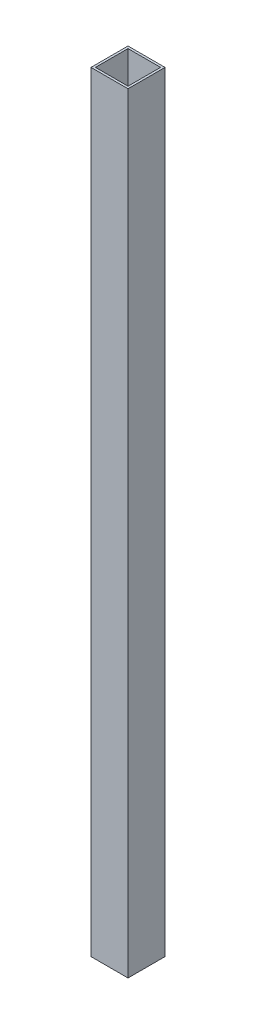
ISO-10303-21;
HEADER;
FILE_DESCRIPTION(('STEP AP214'),'2;1');
FILE_NAME('part.step','',(''),(''),'','','');
FILE_SCHEMA(('AUTOMOTIVE_DESIGN { 1 0 10303 214 1 1 1 1 }'));
ENDSEC;
DATA;
#1=APPLICATION_CONTEXT('core data for automotive mechanical design processes');
#2=APPLICATION_PROTOCOL_DEFINITION('international standard','automotive_design',2000,#1);
#3=PRODUCT_CONTEXT('',#1,'mechanical');
#4=PRODUCT('Part','Part','',(#3));
#5=PRODUCT_RELATED_PRODUCT_CATEGORY('part','',(#4));
#6=PRODUCT_DEFINITION_FORMATION('','',#4);
#7=PRODUCT_DEFINITION_CONTEXT('part definition',#1,'design');
#8=PRODUCT_DEFINITION('design','',#6,#7);
#9=PRODUCT_DEFINITION_SHAPE('','',#8);
#10=(LENGTH_UNIT() NAMED_UNIT(*) SI_UNIT(.MILLI.,.METRE.));
#11=(NAMED_UNIT(*) PLANE_ANGLE_UNIT() SI_UNIT($,.RADIAN.));
#12=(NAMED_UNIT(*) SI_UNIT($,.STERADIAN.) SOLID_ANGLE_UNIT());
#13=UNCERTAINTY_MEASURE_WITH_UNIT(LENGTH_MEASURE(1.E-05),#10,'distance_accuracy_value','');
#14=(GEOMETRIC_REPRESENTATION_CONTEXT(3) GLOBAL_UNCERTAINTY_ASSIGNED_CONTEXT((#13)) GLOBAL_UNIT_ASSIGNED_CONTEXT((#10,
#11,#12)) REPRESENTATION_CONTEXT('',''));
#15=CARTESIAN_POINT('',(0.,0.,0.));
#16=DIRECTION('',(0.,0.,1.));
#17=DIRECTION('',(1.,0.,0.));
#18=AXIS2_PLACEMENT_3D('',#15,#16,#17);
#19=CARTESIAN_POINT('',(0.,260.,0.));
#20=DIRECTION('',(0.,1.,0.));
#21=DIRECTION('',(0.,0.,1.));
#22=AXIS2_PLACEMENT_3D('',#19,#20,#21);
#23=PLANE('',#22);
#24=DIRECTION('',(0.,0.,1.));
#25=VECTOR('',#24,1.);
#26=CARTESIAN_POINT('',(-26.6277544150477,260.,-1.83717263154866));
#27=LINE('',#26,#25);
#28=CARTESIAN_POINT('',(-26.6277544150477,260.,-1.83717263154866));
#29=VERTEX_POINT('',#28);
#30=CARTESIAN_POINT('',(-26.6277544150477,260.,10.6628273684513));
#31=VERTEX_POINT('',#30);
#32=EDGE_CURVE('E136',#29,#31,#27,.T.);
#33=ORIENTED_EDGE('',*,*,#32,.T.);
#34=DIRECTION('',(1.,0.,0.));
#35=VECTOR('',#34,1.);
#36=CARTESIAN_POINT('',(-26.6277544150477,260.,10.6628273684513));
#37=LINE('',#36,#35);
#38=CARTESIAN_POINT('',(-14.1277544150477,260.,10.6628273684513));
#39=VERTEX_POINT('',#38);
#40=EDGE_CURVE('E139',#31,#39,#37,.T.);
#41=ORIENTED_EDGE('',*,*,#40,.T.);
#42=DIRECTION('',(0.,0.,-1.));
#43=VECTOR('',#42,1.);
#44=CARTESIAN_POINT('',(-14.1277544150477,260.,-1.83717263154866));
#45=LINE('',#44,#43);
#46=CARTESIAN_POINT('',(-14.1277544150477,260.,-1.83717263154866));
#47=VERTEX_POINT('',#46);
#48=EDGE_CURVE('E142',#39,#47,#45,.T.);
#49=ORIENTED_EDGE('',*,*,#48,.T.);
#50=DIRECTION('',(-1.,0.,0.));
#51=VECTOR('',#50,1.);
#52=CARTESIAN_POINT('',(-26.6277544150477,260.,-1.83717263154866));
#53=LINE('',#52,#51);
#54=EDGE_CURVE('E144',#47,#29,#53,.T.);
#55=ORIENTED_EDGE('',*,*,#54,.T.);
#56=EDGE_LOOP('',(#33,#41,#49,#55));
#57=FACE_BOUND('',#56,.T.);
#58=DIRECTION('',(-1.,0.,0.));
#59=VECTOR('',#58,1.);
#60=CARTESIAN_POINT('',(-25.8777544150477,260.,-1.08717263154866));
#61=LINE('',#60,#59);
#62=CARTESIAN_POINT('',(-14.8777544150477,260.,-1.08717263154866));
#63=VERTEX_POINT('',#62);
#64=CARTESIAN_POINT('',(-25.8777544150477,260.,-1.08717263154866));
#65=VERTEX_POINT('',#64);
#66=EDGE_CURVE('E108',#63,#65,#61,.T.);
#67=ORIENTED_EDGE('',*,*,#66,.F.);
#68=DIRECTION('',(0.,0.,-1.));
#69=VECTOR('',#68,1.);
#70=CARTESIAN_POINT('',(-14.8777544150477,260.,-1.08717263154866));
#71=LINE('',#70,#69);
#72=CARTESIAN_POINT('',(-14.8777544150477,260.,9.91282736845134));
#73=VERTEX_POINT('',#72);
#74=EDGE_CURVE('E100',#73,#63,#71,.T.);
#75=ORIENTED_EDGE('',*,*,#74,.F.);
#76=DIRECTION('',(1.,0.,0.));
#77=VECTOR('',#76,1.);
#78=CARTESIAN_POINT('',(-25.8777544150477,260.,9.91282736845134));
#79=LINE('',#78,#77);
#80=CARTESIAN_POINT('',(-25.8777544150477,260.,9.91282736845134));
#81=VERTEX_POINT('',#80);
#82=EDGE_CURVE('E122',#81,#73,#79,.T.);
#83=ORIENTED_EDGE('',*,*,#82,.F.);
#84=DIRECTION('',(0.,0.,1.));
#85=VECTOR('',#84,1.);
#86=CARTESIAN_POINT('',(-25.8777544150477,260.,-1.08717263154866));
#87=LINE('',#86,#85);
#88=EDGE_CURVE('E120',#65,#81,#87,.T.);
#89=ORIENTED_EDGE('',*,*,#88,.F.);
#90=EDGE_LOOP('',(#67,#75,#83,#89));
#91=FACE_BOUND('',#90,.T.);
#92=ADVANCED_FACE('F35',(#57,#91),#23,.T.);
#93=CARTESIAN_POINT('',(0.,0.,0.));
#94=DIRECTION('',(0.,1.,0.));
#95=DIRECTION('',(0.,0.,1.));
#96=AXIS2_PLACEMENT_3D('',#93,#94,#95);
#97=PLANE('',#96);
#98=DIRECTION('',(0.,0.,1.));
#99=VECTOR('',#98,1.);
#100=CARTESIAN_POINT('',(-26.6277544150477,0.,-1.83717263154866));
#101=LINE('',#100,#99);
#102=CARTESIAN_POINT('',(-26.6277544150477,0.,-1.83717263154866));
#103=VERTEX_POINT('',#102);
#104=CARTESIAN_POINT('',(-26.6277544150477,0.,10.6628273684513));
#105=VERTEX_POINT('',#104);
#106=EDGE_CURVE('E116',#103,#105,#101,.T.);
#107=ORIENTED_EDGE('',*,*,#106,.F.);
#108=DIRECTION('',(-1.,0.,0.));
#109=VECTOR('',#108,1.);
#110=CARTESIAN_POINT('',(-26.6277544150477,0.,-1.83717263154866));
#111=LINE('',#110,#109);
#112=CARTESIAN_POINT('',(-14.1277544150477,0.,-1.83717263154866));
#113=VERTEX_POINT('',#112);
#114=EDGE_CURVE('E140',#113,#103,#111,.T.);
#115=ORIENTED_EDGE('',*,*,#114,.F.);
#116=DIRECTION('',(0.,0.,-1.));
#117=VECTOR('',#116,1.);
#118=CARTESIAN_POINT('',(-14.1277544150477,0.,-1.83717263154866));
#119=LINE('',#118,#117);
#120=CARTESIAN_POINT('',(-14.1277544150477,0.,10.6628273684513));
#121=VERTEX_POINT('',#120);
#122=EDGE_CURVE('E151',#121,#113,#119,.T.);
#123=ORIENTED_EDGE('',*,*,#122,.F.);
#124=DIRECTION('',(1.,0.,0.));
#125=VECTOR('',#124,1.);
#126=CARTESIAN_POINT('',(-26.6277544150477,0.,10.6628273684513));
#127=LINE('',#126,#125);
#128=EDGE_CURVE('E149',#105,#121,#127,.T.);
#129=ORIENTED_EDGE('',*,*,#128,.F.);
#130=EDGE_LOOP('',(#107,#115,#123,#129));
#131=FACE_BOUND('',#130,.T.);
#132=DIRECTION('',(0.,0.,-1.));
#133=VECTOR('',#132,1.);
#134=CARTESIAN_POINT('',(-14.8777544150477,0.,-1.08717263154866));
#135=LINE('',#134,#133);
#136=CARTESIAN_POINT('',(-14.8777544150477,0.,9.91282736845134));
#137=VERTEX_POINT('',#136);
#138=CARTESIAN_POINT('',(-14.8777544150477,0.,-1.08717263154866));
#139=VERTEX_POINT('',#138);
#140=EDGE_CURVE('E58',#137,#139,#135,.T.);
#141=ORIENTED_EDGE('',*,*,#140,.T.);
#142=DIRECTION('',(-1.,0.,0.));
#143=VECTOR('',#142,1.);
#144=CARTESIAN_POINT('',(-25.8777544150477,0.,-1.08717263154866));
#145=LINE('',#144,#143);
#146=CARTESIAN_POINT('',(-25.8777544150477,0.,-1.08717263154866));
#147=VERTEX_POINT('',#146);
#148=EDGE_CURVE('E115',#139,#147,#145,.T.);
#149=ORIENTED_EDGE('',*,*,#148,.T.);
#150=DIRECTION('',(0.,0.,1.));
#151=VECTOR('',#150,1.);
#152=CARTESIAN_POINT('',(-25.8777544150477,0.,-1.08717263154866));
#153=LINE('',#152,#151);
#154=CARTESIAN_POINT('',(-25.8777544150477,0.,9.91282736845134));
#155=VERTEX_POINT('',#154);
#156=EDGE_CURVE('E128',#147,#155,#153,.T.);
#157=ORIENTED_EDGE('',*,*,#156,.T.);
#158=DIRECTION('',(1.,0.,0.));
#159=VECTOR('',#158,1.);
#160=CARTESIAN_POINT('',(-25.8777544150477,0.,9.91282736845134));
#161=LINE('',#160,#159);
#162=EDGE_CURVE('E109',#155,#137,#161,.T.);
#163=ORIENTED_EDGE('',*,*,#162,.T.);
#164=EDGE_LOOP('',(#141,#149,#157,#163));
#165=FACE_BOUND('',#164,.T.);
#166=ADVANCED_FACE('F169',(#131,#165),#97,.F.);
#167=CARTESIAN_POINT('',(-26.6277544150477,260.,-1.83717263154866));
#168=DIRECTION('',(1.,0.,0.));
#169=DIRECTION('',(0.,0.,-1.));
#170=AXIS2_PLACEMENT_3D('',#167,#168,#169);
#171=PLANE('',#170);
#172=ORIENTED_EDGE('',*,*,#106,.T.);
#173=DIRECTION('',(0.,-1.,0.));
#174=VECTOR('',#173,1.);
#175=CARTESIAN_POINT('',(-26.6277544150477,260.,10.6628273684513));
#176=LINE('',#175,#174);
#177=EDGE_CURVE('E11',#31,#105,#176,.T.);
#178=ORIENTED_EDGE('',*,*,#177,.F.);
#179=ORIENTED_EDGE('',*,*,#32,.F.);
#180=DIRECTION('',(0.,-1.,0.));
#181=VECTOR('',#180,1.);
#182=CARTESIAN_POINT('',(-26.6277544150477,260.,-1.83717263154866));
#183=LINE('',#182,#181);
#184=EDGE_CURVE('E146',#29,#103,#183,.T.);
#185=ORIENTED_EDGE('',*,*,#184,.T.);
#186=EDGE_LOOP('',(#172,#178,#179,#185));
#187=FACE_BOUND('',#186,.T.);
#188=ADVANCED_FACE('F37',(#187),#171,.F.);
#189=CARTESIAN_POINT('',(-26.6277544150477,260.,10.6628273684513));
#190=DIRECTION('',(0.,0.,-1.));
#191=DIRECTION('',(-1.,0.,0.));
#192=AXIS2_PLACEMENT_3D('',#189,#190,#191);
#193=PLANE('',#192);
#194=ORIENTED_EDGE('',*,*,#128,.T.);
#195=DIRECTION('',(0.,-1.,0.));
#196=VECTOR('',#195,1.);
#197=CARTESIAN_POINT('',(-14.1277544150477,260.,10.6628273684513));
#198=LINE('',#197,#196);
#199=EDGE_CURVE('E43',#39,#121,#198,.T.);
#200=ORIENTED_EDGE('',*,*,#199,.F.);
#201=ORIENTED_EDGE('',*,*,#40,.F.);
#202=ORIENTED_EDGE('',*,*,#177,.T.);
#203=EDGE_LOOP('',(#194,#200,#201,#202));
#204=FACE_BOUND('',#203,.T.);
#205=ADVANCED_FACE('F179',(#204),#193,.F.);
#206=CARTESIAN_POINT('',(-14.1277544150477,260.,-1.83717263154866));
#207=DIRECTION('',(-1.,0.,0.));
#208=DIRECTION('',(0.,0.,1.));
#209=AXIS2_PLACEMENT_3D('',#206,#207,#208);
#210=PLANE('',#209);
#211=ORIENTED_EDGE('',*,*,#122,.T.);
#212=DIRECTION('',(0.,-1.,0.));
#213=VECTOR('',#212,1.);
#214=CARTESIAN_POINT('',(-14.1277544150477,260.,-1.83717263154866));
#215=LINE('',#214,#213);
#216=EDGE_CURVE('E156',#47,#113,#215,.T.);
#217=ORIENTED_EDGE('',*,*,#216,.F.);
#218=ORIENTED_EDGE('',*,*,#48,.F.);
#219=ORIENTED_EDGE('',*,*,#199,.T.);
#220=EDGE_LOOP('',(#211,#217,#218,#219));
#221=FACE_BOUND('',#220,.T.);
#222=ADVANCED_FACE('F163',(#221),#210,.F.);
#223=CARTESIAN_POINT('',(-26.6277544150477,260.,-1.83717263154866));
#224=DIRECTION('',(0.,0.,1.));
#225=DIRECTION('',(1.,0.,0.));
#226=AXIS2_PLACEMENT_3D('',#223,#224,#225);
#227=PLANE('',#226);
#228=ORIENTED_EDGE('',*,*,#114,.T.);
#229=ORIENTED_EDGE('',*,*,#184,.F.);
#230=ORIENTED_EDGE('',*,*,#54,.F.);
#231=ORIENTED_EDGE('',*,*,#216,.T.);
#232=EDGE_LOOP('',(#228,#229,#230,#231));
#233=FACE_BOUND('',#232,.T.);
#234=ADVANCED_FACE('F173',(#233),#227,.F.);
#235=CARTESIAN_POINT('',(-14.8777544150477,260.,-1.08717263154866));
#236=DIRECTION('',(-1.,0.,0.));
#237=DIRECTION('',(0.,0.,1.));
#238=AXIS2_PLACEMENT_3D('',#235,#236,#237);
#239=PLANE('',#238);
#240=ORIENTED_EDGE('',*,*,#140,.F.);
#241=DIRECTION('',(0.,-1.,0.));
#242=VECTOR('',#241,1.);
#243=CARTESIAN_POINT('',(-14.8777544150477,260.,9.91282736845134));
#244=LINE('',#243,#242);
#245=EDGE_CURVE('E104',#73,#137,#244,.T.);
#246=ORIENTED_EDGE('',*,*,#245,.F.);
#247=ORIENTED_EDGE('',*,*,#74,.T.);
#248=DIRECTION('',(0.,-1.,0.));
#249=VECTOR('',#248,1.);
#250=CARTESIAN_POINT('',(-14.8777544150477,260.,-1.08717263154866));
#251=LINE('',#250,#249);
#252=EDGE_CURVE('E103',#63,#139,#251,.T.);
#253=ORIENTED_EDGE('',*,*,#252,.T.);
#254=EDGE_LOOP('',(#240,#246,#247,#253));
#255=FACE_BOUND('',#254,.T.);
#256=ADVANCED_FACE('F102',(#255),#239,.T.);
#257=CARTESIAN_POINT('',(-25.8777544150477,260.,-1.08717263154866));
#258=DIRECTION('',(0.,0.,1.));
#259=DIRECTION('',(1.,0.,0.));
#260=AXIS2_PLACEMENT_3D('',#257,#258,#259);
#261=PLANE('',#260);
#262=ORIENTED_EDGE('',*,*,#148,.F.);
#263=ORIENTED_EDGE('',*,*,#252,.F.);
#264=ORIENTED_EDGE('',*,*,#66,.T.);
#265=DIRECTION('',(0.,-1.,0.));
#266=VECTOR('',#265,1.);
#267=CARTESIAN_POINT('',(-25.8777544150477,260.,-1.08717263154866));
#268=LINE('',#267,#266);
#269=EDGE_CURVE('E117',#65,#147,#268,.T.);
#270=ORIENTED_EDGE('',*,*,#269,.T.);
#271=EDGE_LOOP('',(#262,#263,#264,#270));
#272=FACE_BOUND('',#271,.T.);
#273=ADVANCED_FACE('F112',(#272),#261,.T.);
#274=CARTESIAN_POINT('',(-25.8777544150477,260.,-1.08717263154866));
#275=DIRECTION('',(1.,0.,0.));
#276=DIRECTION('',(0.,0.,-1.));
#277=AXIS2_PLACEMENT_3D('',#274,#275,#276);
#278=PLANE('',#277);
#279=ORIENTED_EDGE('',*,*,#156,.F.);
#280=ORIENTED_EDGE('',*,*,#269,.F.);
#281=ORIENTED_EDGE('',*,*,#88,.T.);
#282=DIRECTION('',(0.,-1.,0.));
#283=VECTOR('',#282,1.);
#284=CARTESIAN_POINT('',(-25.8777544150477,260.,9.91282736845134));
#285=LINE('',#284,#283);
#286=EDGE_CURVE('E50',#81,#155,#285,.T.);
#287=ORIENTED_EDGE('',*,*,#286,.T.);
#288=EDGE_LOOP('',(#279,#280,#281,#287));
#289=FACE_BOUND('',#288,.T.);
#290=ADVANCED_FACE('F202',(#289),#278,.T.);
#291=CARTESIAN_POINT('',(-25.8777544150477,260.,9.91282736845134));
#292=DIRECTION('',(0.,0.,-1.));
#293=DIRECTION('',(-1.,0.,0.));
#294=AXIS2_PLACEMENT_3D('',#291,#292,#293);
#295=PLANE('',#294);
#296=ORIENTED_EDGE('',*,*,#162,.F.);
#297=ORIENTED_EDGE('',*,*,#286,.F.);
#298=ORIENTED_EDGE('',*,*,#82,.T.);
#299=ORIENTED_EDGE('',*,*,#245,.T.);
#300=EDGE_LOOP('',(#296,#297,#298,#299));
#301=FACE_BOUND('',#300,.T.);
#302=ADVANCED_FACE('F206',(#301),#295,.T.);
#303=CLOSED_SHELL('',(#92,#166,#188,#205,#222,#234,#256,#273,#290,#302));
#304=MANIFOLD_SOLID_BREP('B2',#303);
#305=ADVANCED_BREP_SHAPE_REPRESENTATION('',(#18,#304),#14);
#306=SHAPE_DEFINITION_REPRESENTATION(#9,#305);
ENDSEC;
END-ISO-10303-21;
